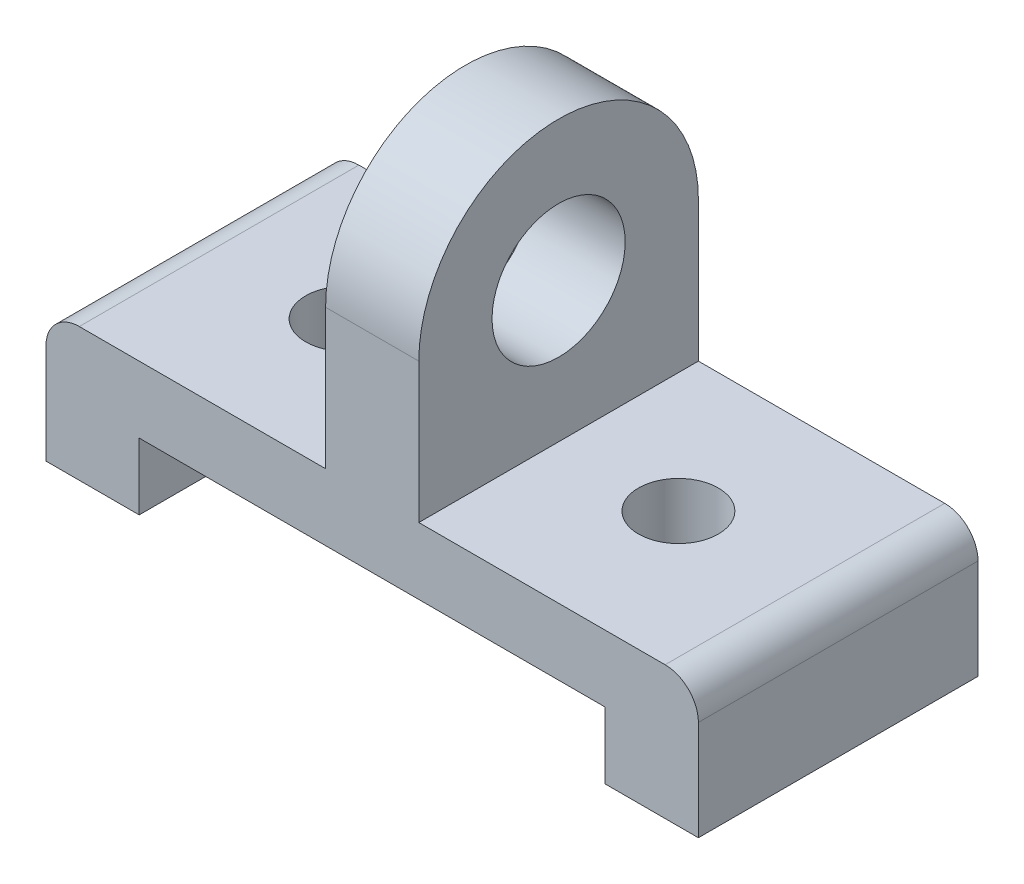
ISO-10303-21;
HEADER;
FILE_DESCRIPTION(('STEP AP214'),'2;1');
FILE_NAME('part.step','',(''),(''),'','','');
FILE_SCHEMA(('AUTOMOTIVE_DESIGN { 1 0 10303 214 1 1 1 1 }'));
ENDSEC;
DATA;
#1=APPLICATION_CONTEXT('core data for automotive mechanical design processes');
#2=APPLICATION_PROTOCOL_DEFINITION('international standard','automotive_design',2000,#1);
#3=PRODUCT_CONTEXT('',#1,'mechanical');
#4=PRODUCT('Part','Part','',(#3));
#5=PRODUCT_RELATED_PRODUCT_CATEGORY('part','',(#4));
#6=PRODUCT_DEFINITION_FORMATION('','',#4);
#7=PRODUCT_DEFINITION_CONTEXT('part definition',#1,'design');
#8=PRODUCT_DEFINITION('design','',#6,#7);
#9=PRODUCT_DEFINITION_SHAPE('','',#8);
#10=(LENGTH_UNIT() NAMED_UNIT(*) SI_UNIT(.MILLI.,.METRE.));
#11=(NAMED_UNIT(*) PLANE_ANGLE_UNIT() SI_UNIT($,.RADIAN.));
#12=(NAMED_UNIT(*) SI_UNIT($,.STERADIAN.) SOLID_ANGLE_UNIT());
#13=UNCERTAINTY_MEASURE_WITH_UNIT(LENGTH_MEASURE(1.E-05),#10,'distance_accuracy_value','');
#14=(GEOMETRIC_REPRESENTATION_CONTEXT(3) GLOBAL_UNCERTAINTY_ASSIGNED_CONTEXT((#13)) GLOBAL_UNIT_ASSIGNED_CONTEXT((#10,
#11,#12)) REPRESENTATION_CONTEXT('',''));
#15=CARTESIAN_POINT('',(0.,0.,0.));
#16=DIRECTION('',(0.,0.,1.));
#17=DIRECTION('',(1.,0.,0.));
#18=AXIS2_PLACEMENT_3D('',#15,#16,#17);
#19=CARTESIAN_POINT('',(7.,31.,0.));
#20=DIRECTION('',(1.,0.,0.));
#21=DIRECTION('',(0.,0.,-1.));
#22=AXIS2_PLACEMENT_3D('',#19,#20,#21);
#23=CYLINDRICAL_SURFACE('',#22,21.);
#24=DIRECTION('',(-1.,0.,0.));
#25=VECTOR('',#24,1.);
#26=CARTESIAN_POINT('',(7.,31.,21.));
#27=LINE('',#26,#25);
#28=CARTESIAN_POINT('',(7.,31.,21.));
#29=VERTEX_POINT('',#28);
#30=CARTESIAN_POINT('',(-7.,31.,21.));
#31=VERTEX_POINT('',#30);
#32=EDGE_CURVE('E301',#29,#31,#27,.T.);
#33=ORIENTED_EDGE('',*,*,#32,.F.);
#34=CARTESIAN_POINT('',(7.,31.,0.));
#35=DIRECTION('',(-1.,0.,0.));
#36=DIRECTION('',(0.,0.,1.));
#37=AXIS2_PLACEMENT_3D('',#34,#35,#36);
#38=CIRCLE('',#37,21.);
#39=CARTESIAN_POINT('',(7.,31.,-21.));
#40=VERTEX_POINT('',#39);
#41=EDGE_CURVE('E51',#40,#29,#38,.F.);
#42=ORIENTED_EDGE('',*,*,#41,.F.);
#43=DIRECTION('',(1.,0.,0.));
#44=VECTOR('',#43,1.);
#45=CARTESIAN_POINT('',(0.,31.,-21.));
#46=LINE('',#45,#44);
#47=CARTESIAN_POINT('',(-7.,31.,-21.));
#48=VERTEX_POINT('',#47);
#49=EDGE_CURVE('E305',#48,#40,#46,.T.);
#50=ORIENTED_EDGE('',*,*,#49,.F.);
#51=CARTESIAN_POINT('',(-7.,31.,0.));
#52=DIRECTION('',(1.,0.,0.));
#53=DIRECTION('',(0.,0.,-1.));
#54=AXIS2_PLACEMENT_3D('',#51,#52,#53);
#55=CIRCLE('',#54,21.);
#56=EDGE_CURVE('E11',#31,#48,#55,.F.);
#57=ORIENTED_EDGE('',*,*,#56,.F.);
#58=EDGE_LOOP('',(#33,#42,#50,#57));
#59=FACE_BOUND('',#58,.T.);
#60=ADVANCED_FACE('F41',(#59),#23,.T.);
#61=CARTESIAN_POINT('',(0.,10.,0.));
#62=DIRECTION('',(0.,1.,0.));
#63=DIRECTION('',(0.,0.,1.));
#64=AXIS2_PLACEMENT_3D('',#61,#62,#63);
#65=PLANE('',#64);
#66=CARTESIAN_POINT('',(-25.,10.,0.));
#67=DIRECTION('',(0.,1.,0.));
#68=DIRECTION('',(0.,0.,1.));
#69=AXIS2_PLACEMENT_3D('',#66,#67,#68);
#70=CIRCLE('',#69,6.);
#71=CARTESIAN_POINT('',(-25.,10.,5.99999999999999));
#72=VERTEX_POINT('',#71);
#73=EDGE_CURVE('E244',#72,#72,#70,.F.);
#74=ORIENTED_EDGE('',*,*,#73,.T.);
#75=EDGE_LOOP('',(#74));
#76=FACE_BOUND('',#75,.T.);
#77=DIRECTION('',(-1.,0.,0.));
#78=VECTOR('',#77,1.);
#79=CARTESIAN_POINT('',(0.,10.,21.));
#80=LINE('',#79,#78);
#81=CARTESIAN_POINT('',(-7.,10.,21.));
#82=VERTEX_POINT('',#81);
#83=CARTESIAN_POINT('',(-44.,10.,21.));
#84=VERTEX_POINT('',#83);
#85=EDGE_CURVE('E165',#82,#84,#80,.T.);
#86=ORIENTED_EDGE('',*,*,#85,.F.);
#87=DIRECTION('',(0.,0.,1.));
#88=VECTOR('',#87,1.);
#89=CARTESIAN_POINT('',(-7.,10.,21.));
#90=LINE('',#89,#88);
#91=CARTESIAN_POINT('',(-7.,10.,-21.));
#92=VERTEX_POINT('',#91);
#93=EDGE_CURVE('E144',#92,#82,#90,.T.);
#94=ORIENTED_EDGE('',*,*,#93,.F.);
#95=DIRECTION('',(-1.,0.,0.));
#96=VECTOR('',#95,1.);
#97=CARTESIAN_POINT('',(0.,10.,-21.));
#98=LINE('',#97,#96);
#99=CARTESIAN_POINT('',(-44.,10.,-21.));
#100=VERTEX_POINT('',#99);
#101=EDGE_CURVE('E151',#92,#100,#98,.T.);
#102=ORIENTED_EDGE('',*,*,#101,.T.);
#103=DIRECTION('',(0.,0.,1.));
#104=VECTOR('',#103,1.);
#105=CARTESIAN_POINT('',(-44.,10.,0.));
#106=LINE('',#105,#104);
#107=EDGE_CURVE('E267',#100,#84,#106,.T.);
#108=ORIENTED_EDGE('',*,*,#107,.T.);
#109=EDGE_LOOP('',(#86,#94,#102,#108));
#110=FACE_BOUND('',#109,.T.);
#111=ADVANCED_FACE('F164',(#76,#110),#65,.T.);
#112=CARTESIAN_POINT('',(25.,10.,0.));
#113=DIRECTION('',(0.,1.,0.));
#114=DIRECTION('',(0.,0.,1.));
#115=AXIS2_PLACEMENT_3D('',#112,#113,#114);
#116=CIRCLE('',#115,6.);
#117=CARTESIAN_POINT('',(25.,10.,6.));
#118=VERTEX_POINT('',#117);
#119=EDGE_CURVE('E240',#118,#118,#116,.T.);
#120=ORIENTED_EDGE('',*,*,#119,.F.);
#121=EDGE_LOOP('',(#120));
#122=FACE_BOUND('',#121,.T.);
#123=CARTESIAN_POINT('',(44.,10.,-21.));
#124=VERTEX_POINT('',#123);
#125=CARTESIAN_POINT('',(7.,10.,-21.));
#126=VERTEX_POINT('',#125);
#127=EDGE_CURVE('E160',#124,#126,#98,.T.);
#128=ORIENTED_EDGE('',*,*,#127,.T.);
#129=DIRECTION('',(0.,0.,-1.));
#130=VECTOR('',#129,1.);
#131=CARTESIAN_POINT('',(7.,10.,21.));
#132=LINE('',#131,#130);
#133=CARTESIAN_POINT('',(7.,10.,21.));
#134=VERTEX_POINT('',#133);
#135=EDGE_CURVE('E148',#134,#126,#132,.T.);
#136=ORIENTED_EDGE('',*,*,#135,.F.);
#137=CARTESIAN_POINT('',(44.,10.,21.));
#138=VERTEX_POINT('',#137);
#139=EDGE_CURVE('E236',#138,#134,#80,.T.);
#140=ORIENTED_EDGE('',*,*,#139,.F.);
#141=DIRECTION('',(0.,0.,1.));
#142=VECTOR('',#141,1.);
#143=CARTESIAN_POINT('',(44.,10.,-21.));
#144=LINE('',#143,#142);
#145=EDGE_CURVE('E295',#138,#124,#144,.F.);
#146=ORIENTED_EDGE('',*,*,#145,.T.);
#147=EDGE_LOOP('',(#128,#136,#140,#146));
#148=FACE_BOUND('',#147,.T.);
#149=ADVANCED_FACE('F319',(#122,#148),#65,.T.);
#150=CARTESIAN_POINT('',(0.,-0.01,0.));
#151=DIRECTION('',(0.,1.,0.));
#152=DIRECTION('',(0.,0.,1.));
#153=AXIS2_PLACEMENT_3D('',#150,#151,#152);
#154=PLANE('',#153);
#155=CARTESIAN_POINT('',(-25.,-0.01,0.));
#156=DIRECTION('',(0.,1.,0.));
#157=DIRECTION('',(0.,0.,1.));
#158=AXIS2_PLACEMENT_3D('',#155,#156,#157);
#159=CIRCLE('',#158,6.);
#160=CARTESIAN_POINT('',(-25.,-0.01,5.99999999999999));
#161=VERTEX_POINT('',#160);
#162=EDGE_CURVE('E258',#161,#161,#159,.F.);
#163=ORIENTED_EDGE('',*,*,#162,.F.);
#164=EDGE_LOOP('',(#163));
#165=FACE_BOUND('',#164,.T.);
#166=CARTESIAN_POINT('',(25.,-0.01,0.));
#167=DIRECTION('',(0.,1.,0.));
#168=DIRECTION('',(0.,0.,1.));
#169=AXIS2_PLACEMENT_3D('',#166,#167,#168);
#170=CIRCLE('',#169,6.);
#171=CARTESIAN_POINT('',(25.,-0.01,6.));
#172=VERTEX_POINT('',#171);
#173=EDGE_CURVE('E254',#172,#172,#170,.T.);
#174=ORIENTED_EDGE('',*,*,#173,.T.);
#175=EDGE_LOOP('',(#174));
#176=FACE_BOUND('',#175,.T.);
#177=DIRECTION('',(0.,0.,-1.));
#178=VECTOR('',#177,1.);
#179=CARTESIAN_POINT('',(35.,-0.01,21.));
#180=LINE('',#179,#178);
#181=CARTESIAN_POINT('',(35.,-0.01,21.));
#182=VERTEX_POINT('',#181);
#183=CARTESIAN_POINT('',(35.,-0.01,-21.));
#184=VERTEX_POINT('',#183);
#185=EDGE_CURVE('E184',#182,#184,#180,.T.);
#186=ORIENTED_EDGE('',*,*,#185,.F.);
#187=DIRECTION('',(-1.,0.,0.));
#188=VECTOR('',#187,1.);
#189=CARTESIAN_POINT('',(0.,-0.01,21.));
#190=LINE('',#189,#188);
#191=CARTESIAN_POINT('',(-35.,-0.01,21.));
#192=VERTEX_POINT('',#191);
#193=EDGE_CURVE('E251',#182,#192,#190,.T.);
#194=ORIENTED_EDGE('',*,*,#193,.T.);
#195=DIRECTION('',(0.,0.,-1.));
#196=VECTOR('',#195,1.);
#197=CARTESIAN_POINT('',(-35.,-0.01,21.));
#198=LINE('',#197,#196);
#199=CARTESIAN_POINT('',(-35.,-0.01,-21.));
#200=VERTEX_POINT('',#199);
#201=EDGE_CURVE('E208',#192,#200,#198,.T.);
#202=ORIENTED_EDGE('',*,*,#201,.T.);
#203=DIRECTION('',(-1.,0.,0.));
#204=VECTOR('',#203,1.);
#205=CARTESIAN_POINT('',(0.,-0.01,-21.));
#206=LINE('',#205,#204);
#207=EDGE_CURVE('E248',#184,#200,#206,.T.);
#208=ORIENTED_EDGE('',*,*,#207,.F.);
#209=EDGE_LOOP('',(#186,#194,#202,#208));
#210=FACE_BOUND('',#209,.T.);
#211=ADVANCED_FACE('F342',(#165,#176,#210),#154,.F.);
#212=CARTESIAN_POINT('',(0.,-0.01,-21.));
#213=DIRECTION('',(0.,0.,-1.));
#214=DIRECTION('',(-1.,0.,0.));
#215=AXIS2_PLACEMENT_3D('',#212,#213,#214);
#216=PLANE('',#215);
#217=DIRECTION('',(0.,-1.,0.));
#218=VECTOR('',#217,1.);
#219=CARTESIAN_POINT('',(-7.,52.,-21.));
#220=LINE('',#219,#218);
#221=EDGE_CURVE('E140',#48,#92,#220,.T.);
#222=ORIENTED_EDGE('',*,*,#221,.F.);
#223=ORIENTED_EDGE('',*,*,#49,.T.);
#224=DIRECTION('',(0.,-1.,0.));
#225=VECTOR('',#224,1.);
#226=CARTESIAN_POINT('',(7.,52.,-21.));
#227=LINE('',#226,#225);
#228=EDGE_CURVE('E147',#40,#126,#227,.T.);
#229=ORIENTED_EDGE('',*,*,#228,.T.);
#230=ORIENTED_EDGE('',*,*,#127,.F.);
#231=CARTESIAN_POINT('',(44.,5.,-21.));
#232=DIRECTION('',(0.,0.,-1.));
#233=DIRECTION('',(-1.,0.,0.));
#234=AXIS2_PLACEMENT_3D('',#231,#232,#233);
#235=CIRCLE('',#234,5.);
#236=CARTESIAN_POINT('',(49.,5.,-21.));
#237=VERTEX_POINT('',#236);
#238=EDGE_CURVE('E298',#124,#237,#235,.T.);
#239=ORIENTED_EDGE('',*,*,#238,.T.);
#240=DIRECTION('',(0.,1.,0.));
#241=VECTOR('',#240,1.);
#242=CARTESIAN_POINT('',(49.,-0.01,-21.));
#243=LINE('',#242,#241);
#244=CARTESIAN_POINT('',(49.,-10.01,-21.));
#245=VERTEX_POINT('',#244);
#246=EDGE_CURVE('E263',#245,#237,#243,.T.);
#247=ORIENTED_EDGE('',*,*,#246,.F.);
#248=DIRECTION('',(1.,0.,0.));
#249=VECTOR('',#248,1.);
#250=CARTESIAN_POINT('',(49.,-10.01,-21.));
#251=LINE('',#250,#249);
#252=CARTESIAN_POINT('',(35.,-10.01,-21.));
#253=VERTEX_POINT('',#252);
#254=EDGE_CURVE('E195',#253,#245,#251,.T.);
#255=ORIENTED_EDGE('',*,*,#254,.F.);
#256=DIRECTION('',(0.,1.,0.));
#257=VECTOR('',#256,1.);
#258=CARTESIAN_POINT('',(35.,-10.01,-21.));
#259=LINE('',#258,#257);
#260=EDGE_CURVE('E199',#253,#184,#259,.T.);
#261=ORIENTED_EDGE('',*,*,#260,.T.);
#262=ORIENTED_EDGE('',*,*,#207,.T.);
#263=DIRECTION('',(0.,1.,0.));
#264=VECTOR('',#263,1.);
#265=CARTESIAN_POINT('',(-35.,-10.01,-21.));
#266=LINE('',#265,#264);
#267=CARTESIAN_POINT('',(-35.,-10.01,-21.));
#268=VERTEX_POINT('',#267);
#269=EDGE_CURVE('E161',#268,#200,#266,.T.);
#270=ORIENTED_EDGE('',*,*,#269,.F.);
#271=DIRECTION('',(1.,0.,0.));
#272=VECTOR('',#271,1.);
#273=CARTESIAN_POINT('',(-49.,-10.01,-21.));
#274=LINE('',#273,#272);
#275=CARTESIAN_POINT('',(-49.,-10.01,-21.));
#276=VERTEX_POINT('',#275);
#277=EDGE_CURVE('E217',#276,#268,#274,.T.);
#278=ORIENTED_EDGE('',*,*,#277,.F.);
#279=DIRECTION('',(0.,1.,0.));
#280=VECTOR('',#279,1.);
#281=CARTESIAN_POINT('',(-49.,-0.01,-21.));
#282=LINE('',#281,#280);
#283=CARTESIAN_POINT('',(-49.,5.,-21.));
#284=VERTEX_POINT('',#283);
#285=EDGE_CURVE('E262',#276,#284,#282,.T.);
#286=ORIENTED_EDGE('',*,*,#285,.T.);
#287=CARTESIAN_POINT('',(-44.,5.,-21.));
#288=DIRECTION('',(0.,0.,-1.));
#289=DIRECTION('',(-1.,0.,0.));
#290=AXIS2_PLACEMENT_3D('',#287,#288,#289);
#291=CIRCLE('',#290,5.);
#292=EDGE_CURVE('E155',#284,#100,#291,.T.);
#293=ORIENTED_EDGE('',*,*,#292,.T.);
#294=ORIENTED_EDGE('',*,*,#101,.F.);
#295=EDGE_LOOP('',(#222,#223,#229,#230,#239,#247,#255,#261,#262,#270,#278,#286,#293,#294));
#296=FACE_BOUND('',#295,.T.);
#297=ADVANCED_FACE('F152',(#296),#216,.T.);
#298=CARTESIAN_POINT('',(49.,-0.01,0.));
#299=DIRECTION('',(-1.,0.,0.));
#300=DIRECTION('',(0.,0.,1.));
#301=AXIS2_PLACEMENT_3D('',#298,#299,#300);
#302=PLANE('',#301);
#303=ORIENTED_EDGE('',*,*,#246,.T.);
#304=DIRECTION('',(0.,0.,1.));
#305=VECTOR('',#304,1.);
#306=CARTESIAN_POINT('',(49.,5.,21.));
#307=LINE('',#306,#305);
#308=CARTESIAN_POINT('',(49.,5.,21.));
#309=VERTEX_POINT('',#308);
#310=EDGE_CURVE('E288',#237,#309,#307,.T.);
#311=ORIENTED_EDGE('',*,*,#310,.T.);
#312=DIRECTION('',(0.,1.,0.));
#313=VECTOR('',#312,1.);
#314=CARTESIAN_POINT('',(49.,-0.01,21.));
#315=LINE('',#314,#313);
#316=CARTESIAN_POINT('',(49.,-10.01,21.));
#317=VERTEX_POINT('',#316);
#318=EDGE_CURVE('E268',#317,#309,#315,.T.);
#319=ORIENTED_EDGE('',*,*,#318,.F.);
#320=DIRECTION('',(0.,0.,1.));
#321=VECTOR('',#320,1.);
#322=CARTESIAN_POINT('',(49.,-10.01,21.));
#323=LINE('',#322,#321);
#324=EDGE_CURVE('E185',#245,#317,#323,.T.);
#325=ORIENTED_EDGE('',*,*,#324,.F.);
#326=EDGE_LOOP('',(#303,#311,#319,#325));
#327=FACE_BOUND('',#326,.T.);
#328=ADVANCED_FACE('F328',(#327),#302,.F.);
#329=CARTESIAN_POINT('',(0.,-0.01,21.));
#330=DIRECTION('',(0.,0.,-1.));
#331=DIRECTION('',(-1.,0.,0.));
#332=AXIS2_PLACEMENT_3D('',#329,#330,#331);
#333=PLANE('',#332);
#334=DIRECTION('',(0.,-1.,0.));
#335=VECTOR('',#334,1.);
#336=CARTESIAN_POINT('',(7.,52.,21.));
#337=LINE('',#336,#335);
#338=EDGE_CURVE('E178',#29,#134,#337,.T.);
#339=ORIENTED_EDGE('',*,*,#338,.F.);
#340=ORIENTED_EDGE('',*,*,#32,.T.);
#341=DIRECTION('',(0.,-1.,0.));
#342=VECTOR('',#341,1.);
#343=CARTESIAN_POINT('',(-7.,52.,21.));
#344=LINE('',#343,#342);
#345=EDGE_CURVE('E181',#31,#82,#344,.T.);
#346=ORIENTED_EDGE('',*,*,#345,.T.);
#347=ORIENTED_EDGE('',*,*,#85,.T.);
#348=CARTESIAN_POINT('',(-44.,5.,21.));
#349=DIRECTION('',(0.,0.,-1.));
#350=DIRECTION('',(-1.,0.,0.));
#351=AXIS2_PLACEMENT_3D('',#348,#349,#350);
#352=CIRCLE('',#351,5.);
#353=CARTESIAN_POINT('',(-49.,5.,21.));
#354=VERTEX_POINT('',#353);
#355=EDGE_CURVE('E280',#84,#354,#352,.F.);
#356=ORIENTED_EDGE('',*,*,#355,.T.);
#357=DIRECTION('',(0.,1.,0.));
#358=VECTOR('',#357,1.);
#359=CARTESIAN_POINT('',(-49.,-0.01,21.));
#360=LINE('',#359,#358);
#361=CARTESIAN_POINT('',(-49.,-10.01,21.));
#362=VERTEX_POINT('',#361);
#363=EDGE_CURVE('E272',#362,#354,#360,.T.);
#364=ORIENTED_EDGE('',*,*,#363,.F.);
#365=DIRECTION('',(1.,0.,0.));
#366=VECTOR('',#365,1.);
#367=CARTESIAN_POINT('',(-49.,-10.01,21.));
#368=LINE('',#367,#366);
#369=CARTESIAN_POINT('',(-35.,-10.01,21.));
#370=VERTEX_POINT('',#369);
#371=EDGE_CURVE('E209',#362,#370,#368,.T.);
#372=ORIENTED_EDGE('',*,*,#371,.T.);
#373=DIRECTION('',(0.,1.,0.));
#374=VECTOR('',#373,1.);
#375=CARTESIAN_POINT('',(-35.,-10.01,21.));
#376=LINE('',#375,#374);
#377=EDGE_CURVE('E224',#370,#192,#376,.T.);
#378=ORIENTED_EDGE('',*,*,#377,.T.);
#379=ORIENTED_EDGE('',*,*,#193,.F.);
#380=DIRECTION('',(0.,1.,0.));
#381=VECTOR('',#380,1.);
#382=CARTESIAN_POINT('',(35.,-10.01,21.));
#383=LINE('',#382,#381);
#384=CARTESIAN_POINT('',(35.,-10.01,21.));
#385=VERTEX_POINT('',#384);
#386=EDGE_CURVE('E205',#385,#182,#383,.T.);
#387=ORIENTED_EDGE('',*,*,#386,.F.);
#388=DIRECTION('',(-1.,0.,0.));
#389=VECTOR('',#388,1.);
#390=CARTESIAN_POINT('',(49.,-10.01,21.));
#391=LINE('',#390,#389);
#392=EDGE_CURVE('E189',#317,#385,#391,.T.);
#393=ORIENTED_EDGE('',*,*,#392,.F.);
#394=ORIENTED_EDGE('',*,*,#318,.T.);
#395=CARTESIAN_POINT('',(44.,5.,21.));
#396=DIRECTION('',(0.,0.,-1.));
#397=DIRECTION('',(-1.,0.,0.));
#398=AXIS2_PLACEMENT_3D('',#395,#396,#397);
#399=CIRCLE('',#398,5.);
#400=EDGE_CURVE('E292',#309,#138,#399,.F.);
#401=ORIENTED_EDGE('',*,*,#400,.T.);
#402=ORIENTED_EDGE('',*,*,#139,.T.);
#403=EDGE_LOOP('',(#339,#340,#346,#347,#356,#364,#372,#378,#379,#387,#393,#394,#401,#402));
#404=FACE_BOUND('',#403,.T.);
#405=ADVANCED_FACE('F315',(#404),#333,.F.);
#406=CARTESIAN_POINT('',(25.,-0.01,0.));
#407=DIRECTION('',(0.,1.,0.));
#408=DIRECTION('',(0.,0.,1.));
#409=AXIS2_PLACEMENT_3D('',#406,#407,#408);
#410=CYLINDRICAL_SURFACE('',#409,6.);
#411=CARTESIAN_POINT('',(25.,-0.01,6.));
#412=CARTESIAN_POINT('',(25.,0.0942708333333333,6.));
#413=CARTESIAN_POINT('',(25.,0.198541666666667,6.));
#414=CARTESIAN_POINT('',(25.,0.407083333333333,6.));
#415=CARTESIAN_POINT('',(25.,0.511354166666667,6.));
#416=CARTESIAN_POINT('',(25.,0.719895833333333,6.));
#417=CARTESIAN_POINT('',(25.,0.824166666666667,6.));
#418=CARTESIAN_POINT('',(25.,1.03270833333333,6.));
#419=CARTESIAN_POINT('',(25.,1.13697916666667,6.));
#420=CARTESIAN_POINT('',(25.,1.34552083333333,6.));
#421=CARTESIAN_POINT('',(25.,1.44979166666667,6.));
#422=CARTESIAN_POINT('',(25.,1.65833333333333,6.));
#423=CARTESIAN_POINT('',(25.,1.76260416666667,6.));
#424=CARTESIAN_POINT('',(25.,1.97114583333333,6.));
#425=CARTESIAN_POINT('',(25.,2.07541666666667,6.));
#426=CARTESIAN_POINT('',(25.,2.28395833333333,6.));
#427=CARTESIAN_POINT('',(25.,2.38822916666667,6.));
#428=CARTESIAN_POINT('',(25.,2.59677083333333,6.));
#429=CARTESIAN_POINT('',(25.,2.70104166666667,6.));
#430=CARTESIAN_POINT('',(25.,2.90958333333333,6.));
#431=CARTESIAN_POINT('',(25.,3.01385416666667,6.));
#432=CARTESIAN_POINT('',(25.,3.22239583333333,6.));
#433=CARTESIAN_POINT('',(25.,3.32666666666667,6.));
#434=CARTESIAN_POINT('',(25.,3.53520833333333,6.));
#435=CARTESIAN_POINT('',(25.,3.63947916666667,6.));
#436=CARTESIAN_POINT('',(25.,3.84802083333333,6.));
#437=CARTESIAN_POINT('',(25.,3.95229166666667,6.));
#438=CARTESIAN_POINT('',(25.,4.16083333333333,6.));
#439=CARTESIAN_POINT('',(25.,4.26510416666667,6.));
#440=CARTESIAN_POINT('',(25.,4.47364583333333,6.));
#441=CARTESIAN_POINT('',(25.,4.57791666666667,6.));
#442=CARTESIAN_POINT('',(25.,4.78645833333333,6.));
#443=CARTESIAN_POINT('',(25.,4.89072916666667,6.));
#444=CARTESIAN_POINT('',(25.,5.09927083333333,6.));
#445=CARTESIAN_POINT('',(25.,5.20354166666667,6.));
#446=CARTESIAN_POINT('',(25.,5.41208333333333,6.));
#447=CARTESIAN_POINT('',(25.,5.51635416666667,6.));
#448=CARTESIAN_POINT('',(25.,5.72489583333333,6.));
#449=CARTESIAN_POINT('',(25.,5.82916666666667,6.));
#450=CARTESIAN_POINT('',(25.,6.03770833333333,6.));
#451=CARTESIAN_POINT('',(25.,6.14197916666667,6.));
#452=CARTESIAN_POINT('',(25.,6.35052083333333,6.));
#453=CARTESIAN_POINT('',(25.,6.45479166666667,6.));
#454=CARTESIAN_POINT('',(25.,6.66333333333333,6.));
#455=CARTESIAN_POINT('',(25.,6.76760416666667,6.));
#456=CARTESIAN_POINT('',(25.,6.97614583333333,6.));
#457=CARTESIAN_POINT('',(25.,7.08041666666667,6.));
#458=CARTESIAN_POINT('',(25.,7.28895833333333,6.));
#459=CARTESIAN_POINT('',(25.,7.39322916666667,6.));
#460=CARTESIAN_POINT('',(25.,7.60177083333333,6.));
#461=CARTESIAN_POINT('',(25.,7.70604166666667,6.));
#462=CARTESIAN_POINT('',(25.,7.91458333333333,6.));
#463=CARTESIAN_POINT('',(25.,8.01885416666667,6.));
#464=CARTESIAN_POINT('',(25.,8.22739583333333,6.));
#465=CARTESIAN_POINT('',(25.,8.33166666666667,6.));
#466=CARTESIAN_POINT('',(25.,8.54020833333333,6.));
#467=CARTESIAN_POINT('',(25.,8.64447916666667,6.));
#468=CARTESIAN_POINT('',(25.,8.85302083333333,6.));
#469=CARTESIAN_POINT('',(25.,8.95729166666667,6.));
#470=CARTESIAN_POINT('',(25.,9.16583333333333,6.));
#471=CARTESIAN_POINT('',(25.,9.27010416666667,6.));
#472=CARTESIAN_POINT('',(25.,9.47864583333333,6.));
#473=CARTESIAN_POINT('',(25.,9.58291666666667,6.));
#474=CARTESIAN_POINT('',(25.,9.79145833333333,6.));
#475=CARTESIAN_POINT('',(25.,9.89572916666667,6.));
#476=CARTESIAN_POINT('',(25.,10.,6.));
#477=B_SPLINE_CURVE_WITH_KNOTS('',3,(#411,#412,#413,#414,#415,#416,#417,#418,#419,#420,#421,
#422,#423,#424,#425,#426,#427,#428,#429,#430,#431,#432,#433,#434,#435,#436,#437,#438,#439,#440,
#441,#442,#443,#444,#445,#446,#447,#448,#449,#450,#451,#452,#453,#454,#455,#456,#457,#458,#459,
#460,#461,#462,#463,#464,#465,#466,#467,#468,#469,#470,#471,#472,#473,#474,#475,#476),
.UNSPECIFIED.,.F.,.F.,(4,2,2,2,2,2,2,2,2,2,2,2,2,2,2,2,2,2,2,2,2,2,2,2,2,2,2,2,2,2,2,2,4),(0.,
0.3128125,0.625625,0.9384375,1.25125,1.5640625,1.876875,2.1896875,2.5025,2.8153125,3.128125,
3.4409375,3.75375,4.0665625,4.379375,4.6921875,5.005,5.3178125,5.630625,5.9434375,6.25625,
6.5690625,6.881875,7.1946875,7.5075,7.8203125,8.133125,8.4459375,8.75875,9.0715625,9.384375,
9.6971875,10.01),.UNSPECIFIED.);
#478=EDGE_CURVE('BSEAM385',#172,#118,#477,.T.);
#479=ORIENTED_EDGE('',*,*,#173,.F.);
#480=ORIENTED_EDGE('',*,*,#119,.T.);
#481=ORIENTED_EDGE('',*,*,#478,.T.);
#482=ORIENTED_EDGE('',*,*,#478,.F.);
#483=EDGE_LOOP('',(#479,#481,#480,#482));
#484=FACE_BOUND('',#483,.T.);
#485=ADVANCED_FACE('F385',(#484),#410,.F.);
#486=CARTESIAN_POINT('',(-49.,-0.01,0.));
#487=DIRECTION('',(-1.,0.,0.));
#488=DIRECTION('',(0.,0.,1.));
#489=AXIS2_PLACEMENT_3D('',#486,#487,#488);
#490=PLANE('',#489);
#491=ORIENTED_EDGE('',*,*,#363,.T.);
#492=DIRECTION('',(0.,0.,1.));
#493=VECTOR('',#492,1.);
#494=CARTESIAN_POINT('',(-49.,5.,0.));
#495=LINE('',#494,#493);
#496=EDGE_CURVE('E283',#354,#284,#495,.F.);
#497=ORIENTED_EDGE('',*,*,#496,.T.);
#498=ORIENTED_EDGE('',*,*,#285,.F.);
#499=DIRECTION('',(0.,0.,-1.));
#500=VECTOR('',#499,1.);
#501=CARTESIAN_POINT('',(-49.,-10.01,21.));
#502=LINE('',#501,#500);
#503=EDGE_CURVE('E220',#362,#276,#502,.T.);
#504=ORIENTED_EDGE('',*,*,#503,.F.);
#505=EDGE_LOOP('',(#491,#497,#498,#504));
#506=FACE_BOUND('',#505,.T.);
#507=ADVANCED_FACE('F353',(#506),#490,.T.);
#508=CARTESIAN_POINT('',(-25.,-0.01,0.));
#509=DIRECTION('',(0.,1.,0.));
#510=DIRECTION('',(0.,0.,1.));
#511=AXIS2_PLACEMENT_3D('',#508,#509,#510);
#512=CYLINDRICAL_SURFACE('',#511,6.);
#513=CARTESIAN_POINT('',(-25.,-0.01,5.99999999999999));
#514=CARTESIAN_POINT('',(-25.,0.0942708333333333,5.99999999999999));
#515=CARTESIAN_POINT('',(-25.,0.198541666666667,5.99999999999999));
#516=CARTESIAN_POINT('',(-25.,0.407083333333333,5.99999999999999));
#517=CARTESIAN_POINT('',(-25.,0.511354166666667,5.99999999999999));
#518=CARTESIAN_POINT('',(-25.,0.719895833333333,5.99999999999999));
#519=CARTESIAN_POINT('',(-25.,0.824166666666667,5.99999999999999));
#520=CARTESIAN_POINT('',(-25.,1.03270833333333,5.99999999999999));
#521=CARTESIAN_POINT('',(-25.,1.13697916666667,5.99999999999999));
#522=CARTESIAN_POINT('',(-25.,1.34552083333333,5.99999999999999));
#523=CARTESIAN_POINT('',(-25.,1.44979166666667,5.99999999999999));
#524=CARTESIAN_POINT('',(-25.,1.65833333333333,5.99999999999999));
#525=CARTESIAN_POINT('',(-25.,1.76260416666667,5.99999999999999));
#526=CARTESIAN_POINT('',(-25.,1.97114583333333,5.99999999999999));
#527=CARTESIAN_POINT('',(-25.,2.07541666666667,5.99999999999999));
#528=CARTESIAN_POINT('',(-25.,2.28395833333333,5.99999999999999));
#529=CARTESIAN_POINT('',(-25.,2.38822916666667,5.99999999999999));
#530=CARTESIAN_POINT('',(-25.,2.59677083333333,5.99999999999999));
#531=CARTESIAN_POINT('',(-25.,2.70104166666667,5.99999999999999));
#532=CARTESIAN_POINT('',(-25.,2.90958333333333,5.99999999999999));
#533=CARTESIAN_POINT('',(-25.,3.01385416666667,5.99999999999999));
#534=CARTESIAN_POINT('',(-25.,3.22239583333333,5.99999999999999));
#535=CARTESIAN_POINT('',(-25.,3.32666666666667,5.99999999999999));
#536=CARTESIAN_POINT('',(-25.,3.53520833333333,5.99999999999999));
#537=CARTESIAN_POINT('',(-25.,3.63947916666667,5.99999999999999));
#538=CARTESIAN_POINT('',(-25.,3.84802083333333,5.99999999999999));
#539=CARTESIAN_POINT('',(-25.,3.95229166666667,5.99999999999999));
#540=CARTESIAN_POINT('',(-25.,4.16083333333333,5.99999999999999));
#541=CARTESIAN_POINT('',(-25.,4.26510416666667,5.99999999999999));
#542=CARTESIAN_POINT('',(-25.,4.47364583333333,5.99999999999999));
#543=CARTESIAN_POINT('',(-25.,4.57791666666667,5.99999999999999));
#544=CARTESIAN_POINT('',(-25.,4.78645833333333,5.99999999999999));
#545=CARTESIAN_POINT('',(-25.,4.89072916666667,5.99999999999999));
#546=CARTESIAN_POINT('',(-25.,5.09927083333333,5.99999999999999));
#547=CARTESIAN_POINT('',(-25.,5.20354166666667,5.99999999999999));
#548=CARTESIAN_POINT('',(-25.,5.41208333333333,5.99999999999999));
#549=CARTESIAN_POINT('',(-25.,5.51635416666667,5.99999999999999));
#550=CARTESIAN_POINT('',(-25.,5.72489583333333,5.99999999999999));
#551=CARTESIAN_POINT('',(-25.,5.82916666666667,5.99999999999999));
#552=CARTESIAN_POINT('',(-25.,6.03770833333333,5.99999999999999));
#553=CARTESIAN_POINT('',(-25.,6.14197916666667,5.99999999999999));
#554=CARTESIAN_POINT('',(-25.,6.35052083333333,5.99999999999999));
#555=CARTESIAN_POINT('',(-25.,6.45479166666667,5.99999999999999));
#556=CARTESIAN_POINT('',(-25.,6.66333333333333,5.99999999999999));
#557=CARTESIAN_POINT('',(-25.,6.76760416666667,5.99999999999999));
#558=CARTESIAN_POINT('',(-25.,6.97614583333333,5.99999999999999));
#559=CARTESIAN_POINT('',(-25.,7.08041666666667,5.99999999999999));
#560=CARTESIAN_POINT('',(-25.,7.28895833333333,5.99999999999999));
#561=CARTESIAN_POINT('',(-25.,7.39322916666667,5.99999999999999));
#562=CARTESIAN_POINT('',(-25.,7.60177083333333,5.99999999999999));
#563=CARTESIAN_POINT('',(-25.,7.70604166666667,5.99999999999999));
#564=CARTESIAN_POINT('',(-25.,7.91458333333333,5.99999999999999));
#565=CARTESIAN_POINT('',(-25.,8.01885416666667,5.99999999999999));
#566=CARTESIAN_POINT('',(-25.,8.22739583333333,5.99999999999999));
#567=CARTESIAN_POINT('',(-25.,8.33166666666667,5.99999999999999));
#568=CARTESIAN_POINT('',(-25.,8.54020833333333,5.99999999999999));
#569=CARTESIAN_POINT('',(-25.,8.64447916666667,5.99999999999999));
#570=CARTESIAN_POINT('',(-25.,8.85302083333333,5.99999999999999));
#571=CARTESIAN_POINT('',(-25.,8.95729166666667,5.99999999999999));
#572=CARTESIAN_POINT('',(-25.,9.16583333333333,5.99999999999999));
#573=CARTESIAN_POINT('',(-25.,9.27010416666667,5.99999999999999));
#574=CARTESIAN_POINT('',(-25.,9.47864583333333,5.99999999999999));
#575=CARTESIAN_POINT('',(-25.,9.58291666666667,5.99999999999999));
#576=CARTESIAN_POINT('',(-25.,9.79145833333333,5.99999999999999));
#577=CARTESIAN_POINT('',(-25.,9.89572916666667,5.99999999999999));
#578=CARTESIAN_POINT('',(-25.,10.,5.99999999999999));
#579=B_SPLINE_CURVE_WITH_KNOTS('',3,(#513,#514,#515,#516,#517,#518,#519,#520,#521,#522,#523,
#524,#525,#526,#527,#528,#529,#530,#531,#532,#533,#534,#535,#536,#537,#538,#539,#540,#541,#542,
#543,#544,#545,#546,#547,#548,#549,#550,#551,#552,#553,#554,#555,#556,#557,#558,#559,#560,#561,
#562,#563,#564,#565,#566,#567,#568,#569,#570,#571,#572,#573,#574,#575,#576,#577,#578),
.UNSPECIFIED.,.F.,.F.,(4,2,2,2,2,2,2,2,2,2,2,2,2,2,2,2,2,2,2,2,2,2,2,2,2,2,2,2,2,2,2,2,4),(0.,
0.3128125,0.625625,0.9384375,1.25125,1.5640625,1.876875,2.1896875,2.5025,2.8153125,3.128125,
3.4409375,3.75375,4.0665625,4.379375,4.6921875,5.005,5.3178125,5.630625,5.9434375,6.25625,
6.5690625,6.881875,7.1946875,7.5075,7.8203125,8.133125,8.4459375,8.75875,9.0715625,9.384375,
9.6971875,10.01),.UNSPECIFIED.);
#580=EDGE_CURVE('BSEAM360',#161,#72,#579,.T.);
#581=ORIENTED_EDGE('',*,*,#162,.T.);
#582=ORIENTED_EDGE('',*,*,#73,.F.);
#583=ORIENTED_EDGE('',*,*,#580,.T.);
#584=ORIENTED_EDGE('',*,*,#580,.F.);
#585=EDGE_LOOP('',(#581,#583,#582,#584));
#586=FACE_BOUND('',#585,.T.);
#587=ADVANCED_FACE('F360',(#586),#512,.F.);
#588=CARTESIAN_POINT('',(-44.,5.,0.));
#589=DIRECTION('',(0.,0.,1.));
#590=DIRECTION('',(1.,0.,0.));
#591=AXIS2_PLACEMENT_3D('',#588,#589,#590);
#592=CYLINDRICAL_SURFACE('',#591,5.);
#593=ORIENTED_EDGE('',*,*,#292,.F.);
#594=ORIENTED_EDGE('',*,*,#496,.F.);
#595=ORIENTED_EDGE('',*,*,#355,.F.);
#596=ORIENTED_EDGE('',*,*,#107,.F.);
#597=EDGE_LOOP('',(#593,#594,#595,#596));
#598=FACE_BOUND('',#597,.T.);
#599=ADVANCED_FACE('F357',(#598),#592,.T.);
#600=CARTESIAN_POINT('',(44.,5.,0.));
#601=DIRECTION('',(0.,0.,-1.));
#602=DIRECTION('',(-1.,0.,0.));
#603=AXIS2_PLACEMENT_3D('',#600,#601,#602);
#604=CYLINDRICAL_SURFACE('',#603,5.);
#605=ORIENTED_EDGE('',*,*,#238,.F.);
#606=ORIENTED_EDGE('',*,*,#145,.F.);
#607=ORIENTED_EDGE('',*,*,#400,.F.);
#608=ORIENTED_EDGE('',*,*,#310,.F.);
#609=EDGE_LOOP('',(#605,#606,#607,#608));
#610=FACE_BOUND('',#609,.T.);
#611=ADVANCED_FACE('F323',(#610),#604,.T.);
#612=CARTESIAN_POINT('',(-35.,-10.01,21.));
#613=DIRECTION('',(1.,0.,0.));
#614=DIRECTION('',(0.,0.,-1.));
#615=AXIS2_PLACEMENT_3D('',#612,#613,#614);
#616=PLANE('',#615);
#617=ORIENTED_EDGE('',*,*,#201,.F.);
#618=ORIENTED_EDGE('',*,*,#377,.F.);
#619=DIRECTION('',(0.,0.,-1.));
#620=VECTOR('',#619,1.);
#621=CARTESIAN_POINT('',(-35.,-10.01,21.));
#622=LINE('',#621,#620);
#623=EDGE_CURVE('E213',#370,#268,#622,.T.);
#624=ORIENTED_EDGE('',*,*,#623,.T.);
#625=ORIENTED_EDGE('',*,*,#269,.T.);
#626=EDGE_LOOP('',(#617,#618,#624,#625));
#627=FACE_BOUND('',#626,.T.);
#628=ADVANCED_FACE('F345',(#627),#616,.T.);
#629=CARTESIAN_POINT('',(0.,-10.01,0.));
#630=DIRECTION('',(0.,1.,0.));
#631=DIRECTION('',(0.,0.,1.));
#632=AXIS2_PLACEMENT_3D('',#629,#630,#631);
#633=PLANE('',#632);
#634=ORIENTED_EDGE('',*,*,#371,.F.);
#635=ORIENTED_EDGE('',*,*,#503,.T.);
#636=ORIENTED_EDGE('',*,*,#277,.T.);
#637=ORIENTED_EDGE('',*,*,#623,.F.);
#638=EDGE_LOOP('',(#634,#635,#636,#637));
#639=FACE_BOUND('',#638,.T.);
#640=ADVANCED_FACE('F350',(#639),#633,.F.);
#641=CARTESIAN_POINT('',(35.,-10.01,21.));
#642=DIRECTION('',(1.,0.,0.));
#643=DIRECTION('',(0.,0.,-1.));
#644=AXIS2_PLACEMENT_3D('',#641,#642,#643);
#645=PLANE('',#644);
#646=ORIENTED_EDGE('',*,*,#185,.T.);
#647=ORIENTED_EDGE('',*,*,#260,.F.);
#648=DIRECTION('',(0.,0.,-1.));
#649=VECTOR('',#648,1.);
#650=CARTESIAN_POINT('',(35.,-10.01,21.));
#651=LINE('',#650,#649);
#652=EDGE_CURVE('E192',#385,#253,#651,.T.);
#653=ORIENTED_EDGE('',*,*,#652,.F.);
#654=ORIENTED_EDGE('',*,*,#386,.T.);
#655=EDGE_LOOP('',(#646,#647,#653,#654));
#656=FACE_BOUND('',#655,.T.);
#657=ADVANCED_FACE('F339',(#656),#645,.F.);
#658=CARTESIAN_POINT('',(0.,-10.01,0.));
#659=DIRECTION('',(0.,1.,0.));
#660=DIRECTION('',(0.,0.,1.));
#661=AXIS2_PLACEMENT_3D('',#658,#659,#660);
#662=PLANE('',#661);
#663=ORIENTED_EDGE('',*,*,#324,.T.);
#664=ORIENTED_EDGE('',*,*,#392,.T.);
#665=ORIENTED_EDGE('',*,*,#652,.T.);
#666=ORIENTED_EDGE('',*,*,#254,.T.);
#667=EDGE_LOOP('',(#663,#664,#665,#666));
#668=FACE_BOUND('',#667,.T.);
#669=ADVANCED_FACE('F331',(#668),#662,.F.);
#670=CARTESIAN_POINT('',(-7.,52.,21.));
#671=DIRECTION('',(1.,0.,0.));
#672=DIRECTION('',(0.,0.,-1.));
#673=AXIS2_PLACEMENT_3D('',#670,#671,#672);
#674=PLANE('',#673);
#675=CARTESIAN_POINT('',(-7.,31.,0.));
#676=DIRECTION('',(1.,0.,0.));
#677=DIRECTION('',(0.,0.,-1.));
#678=AXIS2_PLACEMENT_3D('',#675,#676,#677);
#679=CIRCLE('',#678,10.);
#680=CARTESIAN_POINT('',(-7.,31.,-10.));
#681=VERTEX_POINT('',#680);
#682=EDGE_CURVE('E167',#681,#681,#679,.T.);
#683=ORIENTED_EDGE('',*,*,#682,.T.);
#684=EDGE_LOOP('',(#683));
#685=FACE_BOUND('',#684,.T.);
#686=ORIENTED_EDGE('',*,*,#345,.F.);
#687=ORIENTED_EDGE('',*,*,#56,.T.);
#688=ORIENTED_EDGE('',*,*,#221,.T.);
#689=ORIENTED_EDGE('',*,*,#93,.T.);
#690=EDGE_LOOP('',(#686,#687,#688,#689));
#691=FACE_BOUND('',#690,.T.);
#692=ADVANCED_FACE('F142',(#685,#691),#674,.F.);
#693=CARTESIAN_POINT('',(7.,52.,21.));
#694=DIRECTION('',(-1.,0.,0.));
#695=DIRECTION('',(0.,0.,1.));
#696=AXIS2_PLACEMENT_3D('',#693,#694,#695);
#697=PLANE('',#696);
#698=CARTESIAN_POINT('',(7.,31.,0.));
#699=DIRECTION('',(-1.,0.,0.));
#700=DIRECTION('',(0.,0.,1.));
#701=AXIS2_PLACEMENT_3D('',#698,#699,#700);
#702=CIRCLE('',#701,10.);
#703=CARTESIAN_POINT('',(7.,31.,10.));
#704=VERTEX_POINT('',#703);
#705=EDGE_CURVE('E45',#704,#704,#702,.T.);
#706=ORIENTED_EDGE('',*,*,#705,.T.);
#707=EDGE_LOOP('',(#706));
#708=FACE_BOUND('',#707,.T.);
#709=ORIENTED_EDGE('',*,*,#228,.F.);
#710=ORIENTED_EDGE('',*,*,#41,.T.);
#711=ORIENTED_EDGE('',*,*,#338,.T.);
#712=ORIENTED_EDGE('',*,*,#135,.T.);
#713=EDGE_LOOP('',(#709,#710,#711,#712));
#714=FACE_BOUND('',#713,.T.);
#715=ADVANCED_FACE('F311',(#708,#714),#697,.F.);
#716=CARTESIAN_POINT('',(-49.,31.,0.));
#717=DIRECTION('',(1.,0.,0.));
#718=DIRECTION('',(0.,0.,-1.));
#719=AXIS2_PLACEMENT_3D('',#716,#717,#718);
#720=CYLINDRICAL_SURFACE('',#719,10.);
#721=ORIENTED_EDGE('',*,*,#705,.F.);
#722=EDGE_LOOP('',(#721));
#723=FACE_BOUND('',#722,.T.);
#724=ORIENTED_EDGE('',*,*,#682,.F.);
#725=EDGE_LOOP('',(#724));
#726=FACE_BOUND('',#725,.T.);
#727=ADVANCED_FACE('F468',(#723,#726),#720,.F.);
#728=CLOSED_SHELL('',(#60,#111,#149,#211,#297,#328,#405,#485,#507,#587,#599,#611,#628,#640,#657,
#669,#692,#715,#727));
#729=MANIFOLD_SOLID_BREP('B2',#728);
#730=ADVANCED_BREP_SHAPE_REPRESENTATION('',(#18,#729),#14);
#731=SHAPE_DEFINITION_REPRESENTATION(#9,#730);
ENDSEC;
END-ISO-10303-21;
